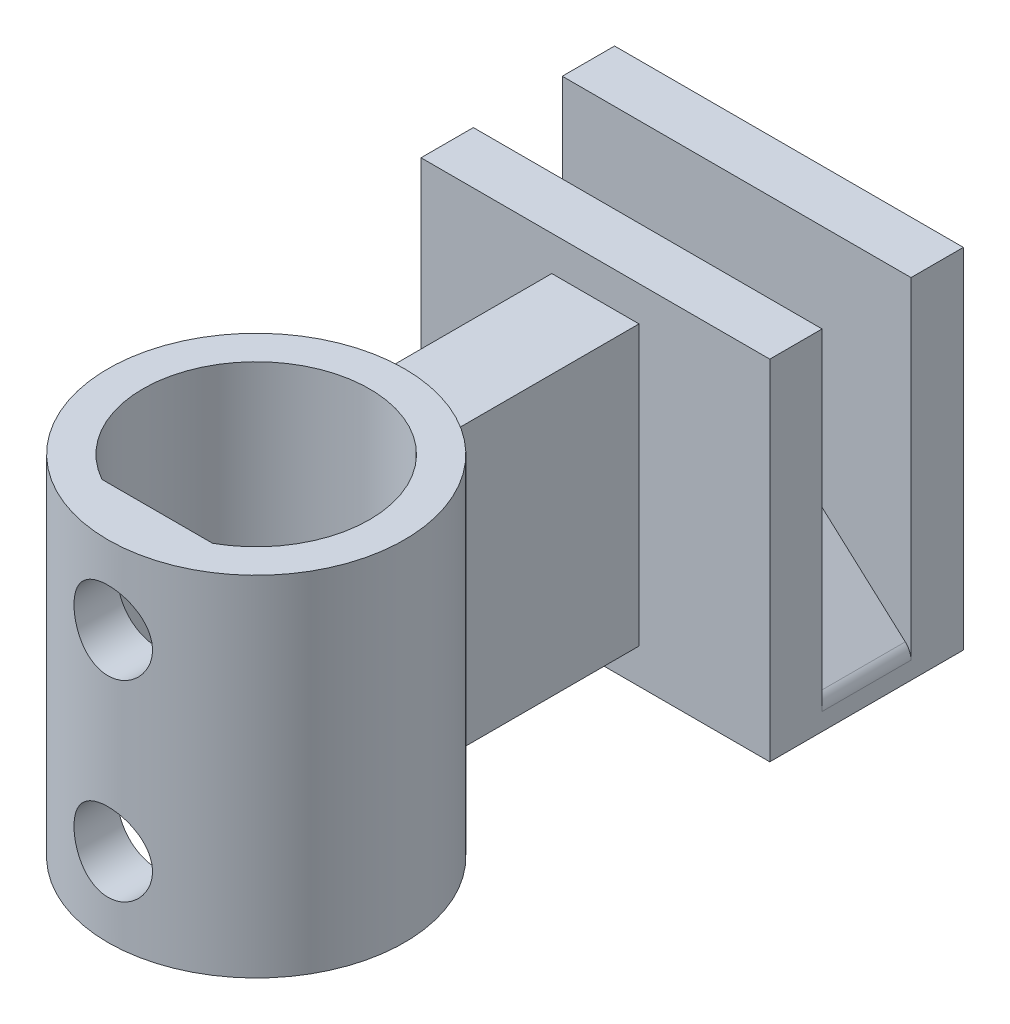
ISO-10303-21;
HEADER;
FILE_DESCRIPTION(('STEP AP214'),'2;1');
FILE_NAME('part.step','',(''),(''),'','','');
FILE_SCHEMA(('AUTOMOTIVE_DESIGN { 1 0 10303 214 1 1 1 1 }'));
ENDSEC;
DATA;
#1=APPLICATION_CONTEXT('core data for automotive mechanical design processes');
#2=APPLICATION_PROTOCOL_DEFINITION('international standard','automotive_design',2000,#1);
#3=PRODUCT_CONTEXT('',#1,'mechanical');
#4=PRODUCT('Part','Part','',(#3));
#5=PRODUCT_RELATED_PRODUCT_CATEGORY('part','',(#4));
#6=PRODUCT_DEFINITION_FORMATION('','',#4);
#7=PRODUCT_DEFINITION_CONTEXT('part definition',#1,'design');
#8=PRODUCT_DEFINITION('design','',#6,#7);
#9=PRODUCT_DEFINITION_SHAPE('','',#8);
#10=(LENGTH_UNIT() NAMED_UNIT(*) SI_UNIT(.MILLI.,.METRE.));
#11=(NAMED_UNIT(*) PLANE_ANGLE_UNIT() SI_UNIT($,.RADIAN.));
#12=(NAMED_UNIT(*) SI_UNIT($,.STERADIAN.) SOLID_ANGLE_UNIT());
#13=UNCERTAINTY_MEASURE_WITH_UNIT(LENGTH_MEASURE(1.E-05),#10,'distance_accuracy_value','');
#14=(GEOMETRIC_REPRESENTATION_CONTEXT(3) GLOBAL_UNCERTAINTY_ASSIGNED_CONTEXT((#13)) GLOBAL_UNIT_ASSIGNED_CONTEXT((#10,
#11,#12)) REPRESENTATION_CONTEXT('',''));
#15=CARTESIAN_POINT('',(0.,0.,0.));
#16=DIRECTION('',(0.,0.,1.));
#17=DIRECTION('',(1.,0.,0.));
#18=AXIS2_PLACEMENT_3D('',#15,#16,#17);
#19=CARTESIAN_POINT('',(0.,39.0416305603426,25.));
#20=DIRECTION('',(0.,-1.,0.));
#21=DIRECTION('',(0.,0.,-1.));
#22=AXIS2_PLACEMENT_3D('',#19,#20,#21);
#23=CYLINDRICAL_SURFACE('',#22,8.5);
#24=CARTESIAN_POINT('',(0.,15.,25.));
#25=DIRECTION('',(0.,-1.,0.));
#26=DIRECTION('',(0.,0.,-1.));
#27=AXIS2_PLACEMENT_3D('',#24,#25,#26);
#28=CIRCLE('',#27,8.5);
#29=CARTESIAN_POINT('',(0.,15.,16.5));
#30=VERTEX_POINT('',#29);
#31=EDGE_CURVE('E186',#30,#30,#28,.T.);
#32=ORIENTED_EDGE('',*,*,#31,.T.);
#33=EDGE_LOOP('',(#32));
#34=FACE_BOUND('',#33,.T.);
#35=CARTESIAN_POINT('',(0.,-5.,25.));
#36=DIRECTION('',(0.,1.,0.));
#37=DIRECTION('',(0.,0.,1.));
#38=AXIS2_PLACEMENT_3D('',#35,#36,#37);
#39=CIRCLE('',#38,8.5);
#40=CARTESIAN_POINT('',(0.,-5.,33.5));
#41=VERTEX_POINT('',#40);
#42=EDGE_CURVE('E192',#41,#41,#39,.F.);
#43=ORIENTED_EDGE('',*,*,#42,.F.);
#44=EDGE_LOOP('',(#43));
#45=FACE_BOUND('',#44,.T.);
#46=CARTESIAN_POINT('',(0.,-3.,25.));
#47=DIRECTION('',(0.,1.,0.));
#48=DIRECTION('',(0.,0.,1.));
#49=AXIS2_PLACEMENT_3D('',#46,#47,#48);
#50=CIRCLE('',#49,8.5);
#51=CARTESIAN_POINT('',(-2.5,-3.,16.875961595364));
#52=VERTEX_POINT('',#51);
#53=CARTESIAN_POINT('',(2.5,-3.,16.875961595364));
#54=VERTEX_POINT('',#53);
#55=EDGE_CURVE('E226',#52,#54,#50,.F.);
#56=ORIENTED_EDGE('',*,*,#55,.T.);
#57=DIRECTION('',(0.,-1.,0.));
#58=VECTOR('',#57,1.);
#59=CARTESIAN_POINT('',(2.5,39.0416305603426,16.875961595364));
#60=LINE('',#59,#58);
#61=CARTESIAN_POINT('',(2.5,13.,16.875961595364));
#62=VERTEX_POINT('',#61);
#63=EDGE_CURVE('E211',#54,#62,#60,.F.);
#64=ORIENTED_EDGE('',*,*,#63,.T.);
#65=CARTESIAN_POINT('',(0.,13.,25.));
#66=DIRECTION('',(0.,-1.,0.));
#67=DIRECTION('',(0.,0.,-1.));
#68=AXIS2_PLACEMENT_3D('',#65,#66,#67);
#69=CIRCLE('',#68,8.5);
#70=CARTESIAN_POINT('',(-2.5,13.,16.875961595364));
#71=VERTEX_POINT('',#70);
#72=EDGE_CURVE('E233',#62,#71,#69,.F.);
#73=ORIENTED_EDGE('',*,*,#72,.T.);
#74=DIRECTION('',(0.,-1.,0.));
#75=VECTOR('',#74,1.);
#76=CARTESIAN_POINT('',(-2.5,39.0416305603426,16.875961595364));
#77=LINE('',#76,#75);
#78=EDGE_CURVE('E230',#71,#52,#77,.T.);
#79=ORIENTED_EDGE('',*,*,#78,.T.);
#80=EDGE_LOOP('',(#56,#64,#73,#79));
#81=FACE_BOUND('',#80,.T.);
#82=CARTESIAN_POINT('',(-2.25,10.5,33.1967981553775));
#83=CARTESIAN_POINT('',(-2.24999694180408,10.6239840002776,33.1968003362435));
#84=CARTESIAN_POINT('',(-2.23971706610501,10.7480005412109,33.1996419584915));
#85=CARTESIAN_POINT('',(-2.198945615888,10.9924544608563,33.2106680196964));
#86=CARTESIAN_POINT('',(-2.16844370713168,11.112889976629,33.2188551904021));
#87=CARTESIAN_POINT('',(-2.0882990785985,11.3466102401079,33.2395815791112));
#88=CARTESIAN_POINT('',(-2.03868300476042,11.459904688051,33.2521147362105));
#89=CARTESIAN_POINT('',(-1.92180166354043,11.6765786826062,33.2801132198881));
#90=CARTESIAN_POINT('',(-1.85453509902009,11.7799574997535,33.2955787619447));
#91=CARTESIAN_POINT('',(-1.70248951742595,11.9764139017784,33.3281265446091));
#92=CARTESIAN_POINT('',(-1.61735395744878,12.0692109081865,33.3452371126252));
#93=CARTESIAN_POINT('',(-1.4327540142738,12.2393902103004,33.3789023677977));
#94=CARTESIAN_POINT('',(-1.33328816547564,12.3167709274061,33.3954569978831));
#95=CARTESIAN_POINT('',(-1.12090838569079,12.4550884366435,33.4264608929721));
#96=CARTESIAN_POINT('',(-1.00780712819347,12.5157466883929,33.4408728427373));
#97=CARTESIAN_POINT('',(-0.772566710508234,12.6170815196129,33.4656427357432));
#98=CARTESIAN_POINT('',(-0.650429055025734,12.6577614172222,33.4760013521304));
#99=CARTESIAN_POINT('',(-0.403511110172187,12.7170778425828,33.4912971460741));
#100=CARTESIAN_POINT('',(-0.278852839843893,12.7361915561904,33.4963515042717));
#101=CARTESIAN_POINT('',(-0.0280034780646866,12.7533339423421,33.5008788349257));
#102=CARTESIAN_POINT('',(0.0981873570184365,12.7513660941808,33.5003527283806));
#103=CARTESIAN_POINT('',(0.34519977639906,12.7267381177659,33.4938644304373));
#104=CARTESIAN_POINT('',(0.466076857336715,12.7045934898765,33.4880376721779));
#105=CARTESIAN_POINT('',(0.702334013138001,12.6410728615727,33.4717623278363));
#106=CARTESIAN_POINT('',(0.817713776487286,12.5996957727456,33.4613134801802));
#107=CARTESIAN_POINT('',(1.04102215095086,12.4984870248307,33.4367663576623));
#108=CARTESIAN_POINT('',(1.14886634833951,12.4384779194592,33.4226332115479));
#109=CARTESIAN_POINT('',(1.3531303740591,12.301844580475,33.3922415251126));
#110=CARTESIAN_POINT('',(1.44954799839656,12.2252171495074,33.375982576028));
#111=CARTESIAN_POINT('',(1.63129857081783,12.0547825542084,33.342521924539));
#112=CARTESIAN_POINT('',(1.71620777876131,11.9605256731685,33.3253065822884));
#113=CARTESIAN_POINT('',(1.86911637013184,11.7589321307718,33.2923181202052));
#114=CARTESIAN_POINT('',(1.93711475347608,11.6515946964081,33.2765450857034));
#115=CARTESIAN_POINT('',(2.05458778503724,11.4259787352489,33.2481731019722));
#116=CARTESIAN_POINT('',(2.10394886477225,11.3076384369629,33.2355937612802));
#117=CARTESIAN_POINT('',(2.18193716023719,11.0639230764637,33.2152779792318));
#118=CARTESIAN_POINT('',(2.21056943128527,10.9385497375025,33.207540357145));
#119=CARTESIAN_POINT('',(2.24556016825425,10.6882860893502,33.1980351929453));
#120=CARTESIAN_POINT('',(2.25255005779307,10.5634903897575,33.1960984643835));
#121=CARTESIAN_POINT('',(2.24579596911986,10.3145136151024,33.1979517680045));
#122=CARTESIAN_POINT('',(2.23205416085442,10.19033247708,33.2017412008412));
#123=CARTESIAN_POINT('',(2.18478304951454,9.94853203437677,33.2144565867633));
#124=CARTESIAN_POINT('',(2.15163187005439,9.83083314067768,33.2232843058655));
#125=CARTESIAN_POINT('',(2.06690749717098,9.60266578735862,33.2449859622244));
#126=CARTESIAN_POINT('',(2.0153319242454,9.49219826384843,33.2578604220901));
#127=CARTESIAN_POINT('',(1.89393612864426,9.27898360406455,33.2865532711528));
#128=CARTESIAN_POINT('',(1.82374430356199,9.17645600255329,33.3024294781708));
#129=CARTESIAN_POINT('',(1.66757023068808,8.98440278488017,33.3352002454647));
#130=CARTESIAN_POINT('',(1.58158505971235,8.89487958119961,33.3520949938724));
#131=CARTESIAN_POINT('',(1.39334723217788,8.72876291555247,33.3855805923336));
#132=CARTESIAN_POINT('',(1.29070161878611,8.65260935870141,33.4021491503459));
#133=CARTESIAN_POINT('',(1.07371678547403,8.51861464758931,33.4326221761272));
#134=CARTESIAN_POINT('',(0.959378187911347,8.46077251937521,33.4465267855714));
#135=CARTESIAN_POINT('',(0.723057226149525,8.36557056201773,33.470015772103));
#136=CARTESIAN_POINT('',(0.60113959611423,8.32805833034544,33.4796321961789));
#137=CARTESIAN_POINT('',(0.352439036803731,8.2741367860407,33.4936022569498));
#138=CARTESIAN_POINT('',(0.225657174963255,8.25772287044393,33.4979570415506));
#139=CARTESIAN_POINT('',(-0.0250604722587875,8.24674873433714,33.5008598374346));
#140=CARTESIAN_POINT('',(-0.148966409472797,8.2515427679478,33.499579436696));
#141=CARTESIAN_POINT('',(-0.394141954180563,8.28135153536109,33.4917428575153));
#142=CARTESIAN_POINT('',(-0.515411657917084,8.30636552970252,33.4851868720061));
#143=CARTESIAN_POINT('',(-0.751107699159933,8.37554121781611,33.4675689262979));
#144=CARTESIAN_POINT('',(-0.865574416324465,8.41957360028427,33.4565374265752));
#145=CARTESIAN_POINT('',(-1.08556048681217,8.5254205314973,33.4311229382255));
#146=CARTESIAN_POINT('',(-1.19107859706731,8.58723754551755,33.4167394850088));
#147=CARTESIAN_POINT('',(-1.39318530515942,8.72879850578497,33.3856885458129));
#148=CARTESIAN_POINT('',(-1.48946543719377,8.80897181418192,33.3689708718519));
#149=CARTESIAN_POINT('',(-1.66742398064291,8.98415288335479,33.3353414220771));
#150=CARTESIAN_POINT('',(-1.74909856114583,9.07916452389294,33.3184295965731));
#151=CARTESIAN_POINT('',(-1.8972708258445,9.2837921479421,33.285906991571));
#152=CARTESIAN_POINT('',(-1.96340296292341,9.39367904330234,33.2703321637851));
#153=CARTESIAN_POINT('',(-2.07615948784757,9.62341015894324,33.2427515934587));
#154=CARTESIAN_POINT('',(-2.12279681152532,9.74324771294936,33.2307434857482));
#155=CARTESIAN_POINT('',(-2.18903256232817,9.96889360228065,33.2133487458215));
#156=CARTESIAN_POINT('',(-2.21184214669942,10.0737109686333,33.2071920574266));
#157=CARTESIAN_POINT('',(-2.24232635318084,10.2856776239988,33.1989160421293));
#158=CARTESIAN_POINT('',(-2.25000264354342,10.3928266546586,33.1967962702092));
#159=CARTESIAN_POINT('',(-2.25,10.5,33.1967981553775));
#160=B_SPLINE_CURVE_WITH_KNOTS('',3,(#82,#83,#84,#85,#86,#87,#88,#89,#90,#91,#92,#93,#94,#95,
#96,#97,#98,#99,#100,#101,#102,#103,#104,#105,#106,#107,#108,#109,#110,#111,#112,#113,#114,#115,
#116,#117,#118,#119,#120,#121,#122,#123,#124,#125,#126,#127,#128,#129,#130,#131,#132,#133,#134,
#135,#136,#137,#138,#139,#140,#141,#142,#143,#144,#145,#146,#147,#148,#149,#150,#151,#152,#153,
#154,#155,#156,#157,#158,#159),.UNSPECIFIED.,.T.,.F.,(4,2,2,2,2,2,2,2,2,2,2,2,2,2,2,2,2,2,2,2,2,
2,2,2,2,2,2,2,2,2,2,2,2,2,2,2,2,2,4),(0.,0.37155797163531,0.743305970231715,1.11453760110695,
1.48579652152091,1.86532086241599,2.24488404596034,2.63043245150024,3.01591680090743,
3.39269333716487,3.76940769129443,4.13675920765004,4.50413151587257,4.87511584526133,
5.24617161521628,5.62845622010334,6.01076342740043,6.3953640456007,6.77987083621654,
7.15304843134813,7.52618696941451,7.89228731518204,8.25843495975225,8.63252754907452,
9.00668944894658,9.39148781847044,9.77626571779774,10.1581177737158,10.539886507824,
10.9101123860205,11.2803247253535,11.6480585642679,12.0158434024024,12.3933170752266,
12.7708896114263,13.156610044578,13.5420741241071,13.8632889681006,14.1844684002793),.UNSPECIFIED.);
#161=CARTESIAN_POINT('',(-2.25,10.5,33.1967981553775));
#162=VERTEX_POINT('',#161);
#163=EDGE_CURVE('E198',#162,#162,#160,.T.);
#164=ORIENTED_EDGE('',*,*,#163,.T.);
#165=EDGE_LOOP('',(#164));
#166=FACE_BOUND('',#165,.T.);
#167=CARTESIAN_POINT('',(-2.25,-0.500000000000002,33.1967981553775));
#168=CARTESIAN_POINT('',(-2.24999694180408,-0.376015999722374,33.1968003362435));
#169=CARTESIAN_POINT('',(-2.23971706610501,-0.251999458789078,33.1996419584915));
#170=CARTESIAN_POINT('',(-2.198945615888,-0.00754553914369019,33.2106680196964));
#171=CARTESIAN_POINT('',(-2.16844370713168,0.112889976628972,33.2188551904021));
#172=CARTESIAN_POINT('',(-2.0882990785985,0.346610240107896,33.2395815791112));
#173=CARTESIAN_POINT('',(-2.03868300476042,0.459904688051024,33.2521147362105));
#174=CARTESIAN_POINT('',(-1.92180166354043,0.676578682606188,33.2801132198881));
#175=CARTESIAN_POINT('',(-1.85453509902009,0.779957499753548,33.2955787619447));
#176=CARTESIAN_POINT('',(-1.70248951742595,0.976413901778359,33.3281265446091));
#177=CARTESIAN_POINT('',(-1.61735395744878,1.06921090818649,33.3452371126252));
#178=CARTESIAN_POINT('',(-1.4327540142738,1.23939021030035,33.3789023677977));
#179=CARTESIAN_POINT('',(-1.33328816547564,1.31677092740614,33.3954569978831));
#180=CARTESIAN_POINT('',(-1.12090838569079,1.45508843664353,33.426460892972));
#181=CARTESIAN_POINT('',(-1.00780712819347,1.51574668839292,33.4408728427372));
#182=CARTESIAN_POINT('',(-0.772566710508234,1.6170815196129,33.4656427357431));
#183=CARTESIAN_POINT('',(-0.650429055025735,1.65776141722221,33.4760013521304));
#184=CARTESIAN_POINT('',(-0.403511110172187,1.71707784258281,33.4912971460741));
#185=CARTESIAN_POINT('',(-0.278852839843893,1.73619155619042,33.4963515042717));
#186=CARTESIAN_POINT('',(-0.0280034780646869,1.75333394234214,33.5008788349257));
#187=CARTESIAN_POINT('',(0.0981873570184361,1.75136609418084,33.5003527283806));
#188=CARTESIAN_POINT('',(0.34519977639906,1.72673811776592,33.4938644304373));
#189=CARTESIAN_POINT('',(0.466076857336715,1.70459348987647,33.4880376721779));
#190=CARTESIAN_POINT('',(0.702334013138001,1.6410728615727,33.4717623278363));
#191=CARTESIAN_POINT('',(0.817713776487285,1.59969577274563,33.4613134801802));
#192=CARTESIAN_POINT('',(1.04102215095086,1.49848702483075,33.4367663576623));
#193=CARTESIAN_POINT('',(1.14886634833951,1.43847791945919,33.4226332115479));
#194=CARTESIAN_POINT('',(1.3531303740591,1.30184458047502,33.3922415251126));
#195=CARTESIAN_POINT('',(1.44954799839656,1.22521714950741,33.375982576028));
#196=CARTESIAN_POINT('',(1.63129857081783,1.05478255420836,33.342521924539));
#197=CARTESIAN_POINT('',(1.71620777876131,0.960525673168511,33.3253065822884));
#198=CARTESIAN_POINT('',(1.86911637013183,0.758932130771777,33.2923181202052));
#199=CARTESIAN_POINT('',(1.93711475347608,0.651594696408099,33.2765450857034));
#200=CARTESIAN_POINT('',(2.05458778503724,0.425978735248875,33.2481731019722));
#201=CARTESIAN_POINT('',(2.10394886477225,0.307638436962872,33.2355937612802));
#202=CARTESIAN_POINT('',(2.18193716023719,0.0639230764637289,33.2152779792318));
#203=CARTESIAN_POINT('',(2.21056943128527,-0.0614502624975041,33.207540357145));
#204=CARTESIAN_POINT('',(2.24556016825425,-0.311713910649751,33.1980351929453));
#205=CARTESIAN_POINT('',(2.25255005779307,-0.436509610242537,33.1960984643835));
#206=CARTESIAN_POINT('',(2.24579596911986,-0.685486384897617,33.1979517680045));
#207=CARTESIAN_POINT('',(2.23205416085442,-0.809667522920008,33.2017412008412));
#208=CARTESIAN_POINT('',(2.18478304951454,-1.05146796562323,33.2144565867633));
#209=CARTESIAN_POINT('',(2.15163187005439,-1.16916685932232,33.2232843058654));
#210=CARTESIAN_POINT('',(2.06690749717098,-1.39733421264138,33.2449859622244));
#211=CARTESIAN_POINT('',(2.0153319242454,-1.50780173615157,33.2578604220901));
#212=CARTESIAN_POINT('',(1.89393612864426,-1.72101639593545,33.2865532711528));
#213=CARTESIAN_POINT('',(1.82374430356199,-1.82354399744671,33.3024294781708));
#214=CARTESIAN_POINT('',(1.66757023068808,-2.01559721511983,33.3352002454647));
#215=CARTESIAN_POINT('',(1.58158505971235,-2.10512041880039,33.3520949938724));
#216=CARTESIAN_POINT('',(1.39334723217788,-2.27123708444753,33.3855805923336));
#217=CARTESIAN_POINT('',(1.29070161878611,-2.34739064129859,33.4021491503459));
#218=CARTESIAN_POINT('',(1.07371678547403,-2.48138535241069,33.4326221761272));
#219=CARTESIAN_POINT('',(0.959378187911347,-2.53922748062479,33.4465267855714));
#220=CARTESIAN_POINT('',(0.723057226149525,-2.63442943798227,33.470015772103));
#221=CARTESIAN_POINT('',(0.60113959611423,-2.67194166965456,33.4796321961789));
#222=CARTESIAN_POINT('',(0.352439036803731,-2.7258632139593,33.4936022569498));
#223=CARTESIAN_POINT('',(0.225657174963256,-2.74227712955607,33.4979570415506));
#224=CARTESIAN_POINT('',(-0.0250604722587871,-2.75325126566286,33.5008598374346));
#225=CARTESIAN_POINT('',(-0.148966409472797,-2.7484572320522,33.499579436696));
#226=CARTESIAN_POINT('',(-0.394141954180563,-2.71864846463891,33.4917428575153));
#227=CARTESIAN_POINT('',(-0.515411657917083,-2.69363447029748,33.4851868720061));
#228=CARTESIAN_POINT('',(-0.751107699159933,-2.62445878218389,33.4675689262979));
#229=CARTESIAN_POINT('',(-0.865574416324465,-2.58042639971573,33.4565374265752));
#230=CARTESIAN_POINT('',(-1.08556048681217,-2.4745794685027,33.4311229382255));
#231=CARTESIAN_POINT('',(-1.19107859706731,-2.41276245448245,33.4167394850088));
#232=CARTESIAN_POINT('',(-1.39318530515942,-2.27120149421503,33.3856885458129));
#233=CARTESIAN_POINT('',(-1.48946543719377,-2.19102818581808,33.3689708718519));
#234=CARTESIAN_POINT('',(-1.66742398064291,-2.01584711664521,33.3353414220771));
#235=CARTESIAN_POINT('',(-1.74909856114582,-1.92083547610706,33.3184295965731));
#236=CARTESIAN_POINT('',(-1.8972708258445,-1.7162078520579,33.285906991571));
#237=CARTESIAN_POINT('',(-1.96340296292341,-1.60632095669767,33.2703321637851));
#238=CARTESIAN_POINT('',(-2.07615948784757,-1.37658984105676,33.2427515934587));
#239=CARTESIAN_POINT('',(-2.12279681152532,-1.25675228705065,33.2307434857482));
#240=CARTESIAN_POINT('',(-2.18903256232817,-1.03110639771935,33.2133487458215));
#241=CARTESIAN_POINT('',(-2.21184214669942,-0.92628903136672,33.2071920574266));
#242=CARTESIAN_POINT('',(-2.24232635318084,-0.714322376001232,33.1989160421293));
#243=CARTESIAN_POINT('',(-2.25000264354342,-0.607173345341352,33.1967962702092));
#244=CARTESIAN_POINT('',(-2.25,-0.500000000000002,33.1967981553775));
#245=B_SPLINE_CURVE_WITH_KNOTS('',3,(#167,#168,#169,#170,#171,#172,#173,#174,#175,#176,#177,
#178,#179,#180,#181,#182,#183,#184,#185,#186,#187,#188,#189,#190,#191,#192,#193,#194,#195,#196,
#197,#198,#199,#200,#201,#202,#203,#204,#205,#206,#207,#208,#209,#210,#211,#212,#213,#214,#215,
#216,#217,#218,#219,#220,#221,#222,#223,#224,#225,#226,#227,#228,#229,#230,#231,#232,#233,#234,
#235,#236,#237,#238,#239,#240,#241,#242,#243,#244),.UNSPECIFIED.,.T.,.F.,(4,2,2,2,2,2,2,2,2,2,2,
2,2,2,2,2,2,2,2,2,2,2,2,2,2,2,2,2,2,2,2,2,2,2,2,2,2,2,4),(0.,0.371557971635309,
0.743305970231715,1.11453760110695,1.48579652152091,1.86532086241599,2.24488404596033,
2.63043245150024,3.01591680090743,3.39269333716487,3.76940769129443,4.13675920765004,
4.50413151587256,4.87511584526133,5.24617161521628,5.62845622010334,6.01076342740043,
6.3953640456007,6.77987083621654,7.15304843134812,7.5261869694145,7.89228731518204,
8.25843495975225,8.63252754907452,9.00668944894658,9.39148781847044,9.77626571779773,
10.1581177737158,10.539886507824,10.9101123860205,11.2803247253535,11.6480585642679,
12.0158434024024,12.3933170752266,12.7708896114263,13.156610044578,13.5420741241071,
13.8632889681006,14.1844684002793),.UNSPECIFIED.);
#246=CARTESIAN_POINT('',(-2.25,-0.500000000000002,33.1967981553775));
#247=VERTEX_POINT('',#246);
#248=EDGE_CURVE('E616',#247,#247,#245,.T.);
#249=ORIENTED_EDGE('',*,*,#248,.T.);
#250=EDGE_LOOP('',(#249));
#251=FACE_BOUND('',#250,.T.);
#252=ADVANCED_FACE('F35',(#34,#45,#81,#166,#251),#23,.T.);
#253=CARTESIAN_POINT('',(0.,0.,5.55));
#254=DIRECTION('',(0.,0.,1.));
#255=DIRECTION('',(1.,0.,0.));
#256=AXIS2_PLACEMENT_3D('',#253,#254,#255);
#257=PLANE('',#256);
#258=DIRECTION('',(0.,1.,0.));
#259=VECTOR('',#258,1.);
#260=CARTESIAN_POINT('',(10.,15.,5.55));
#261=LINE('',#260,#259);
#262=CARTESIAN_POINT('',(10.,-5.,5.55));
#263=VERTEX_POINT('',#262);
#264=CARTESIAN_POINT('',(10.,15.,5.55));
#265=VERTEX_POINT('',#264);
#266=EDGE_CURVE('E263',#263,#265,#261,.T.);
#267=ORIENTED_EDGE('',*,*,#266,.T.);
#268=DIRECTION('',(-1.,0.,0.));
#269=VECTOR('',#268,1.);
#270=CARTESIAN_POINT('',(-10.,15.,5.55));
#271=LINE('',#270,#269);
#272=CARTESIAN_POINT('',(-10.,15.,5.55));
#273=VERTEX_POINT('',#272);
#274=EDGE_CURVE('E266',#265,#273,#271,.T.);
#275=ORIENTED_EDGE('',*,*,#274,.T.);
#276=DIRECTION('',(0.,-1.,0.));
#277=VECTOR('',#276,1.);
#278=CARTESIAN_POINT('',(-10.,15.,5.55));
#279=LINE('',#278,#277);
#280=CARTESIAN_POINT('',(-10.,-5.,5.55));
#281=VERTEX_POINT('',#280);
#282=EDGE_CURVE('E269',#273,#281,#279,.T.);
#283=ORIENTED_EDGE('',*,*,#282,.T.);
#284=DIRECTION('',(1.,0.,0.));
#285=VECTOR('',#284,1.);
#286=CARTESIAN_POINT('',(-10.,-5.,5.55));
#287=LINE('',#286,#285);
#288=EDGE_CURVE('E272',#281,#263,#287,.T.);
#289=ORIENTED_EDGE('',*,*,#288,.T.);
#290=EDGE_LOOP('',(#267,#275,#283,#289));
#291=FACE_BOUND('',#290,.T.);
#292=DIRECTION('',(-1.,0.,0.));
#293=VECTOR('',#292,1.);
#294=CARTESIAN_POINT('',(-2.5,13.,5.55));
#295=LINE('',#294,#293);
#296=CARTESIAN_POINT('',(2.5,13.,5.55));
#297=VERTEX_POINT('',#296);
#298=CARTESIAN_POINT('',(-2.5,13.,5.55));
#299=VERTEX_POINT('',#298);
#300=EDGE_CURVE('E215',#297,#299,#295,.T.);
#301=ORIENTED_EDGE('',*,*,#300,.F.);
#302=DIRECTION('',(0.,1.,0.));
#303=VECTOR('',#302,1.);
#304=CARTESIAN_POINT('',(2.5,13.,5.55));
#305=LINE('',#304,#303);
#306=CARTESIAN_POINT('',(2.5,-3.,5.55));
#307=VERTEX_POINT('',#306);
#308=EDGE_CURVE('E219',#307,#297,#305,.T.);
#309=ORIENTED_EDGE('',*,*,#308,.F.);
#310=DIRECTION('',(1.,0.,0.));
#311=VECTOR('',#310,1.);
#312=CARTESIAN_POINT('',(-2.5,-3.,5.55));
#313=LINE('',#312,#311);
#314=CARTESIAN_POINT('',(-2.5,-3.,5.55));
#315=VERTEX_POINT('',#314);
#316=EDGE_CURVE('E208',#315,#307,#313,.T.);
#317=ORIENTED_EDGE('',*,*,#316,.F.);
#318=DIRECTION('',(0.,-1.,0.));
#319=VECTOR('',#318,1.);
#320=CARTESIAN_POINT('',(-2.5,13.,5.55));
#321=LINE('',#320,#319);
#322=EDGE_CURVE('E52',#299,#315,#321,.T.);
#323=ORIENTED_EDGE('',*,*,#322,.F.);
#324=EDGE_LOOP('',(#301,#309,#317,#323));
#325=FACE_BOUND('',#324,.T.);
#326=ADVANCED_FACE('F396',(#291,#325),#257,.T.);
#327=CARTESIAN_POINT('',(10.,-5.,2.55));
#328=DIRECTION('',(-1.,0.,0.));
#329=DIRECTION('',(0.,0.,1.));
#330=AXIS2_PLACEMENT_3D('',#327,#328,#329);
#331=PLANE('',#330);
#332=DIRECTION('',(0.,0.,-1.));
#333=VECTOR('',#332,1.);
#334=CARTESIAN_POINT('',(10.,-5.,2.55));
#335=LINE('',#334,#333);
#336=CARTESIAN_POINT('',(10.,-5.,-5.55));
#337=VERTEX_POINT('',#336);
#338=EDGE_CURVE('E290',#263,#337,#335,.T.);
#339=ORIENTED_EDGE('',*,*,#338,.T.);
#340=DIRECTION('',(0.,1.,0.));
#341=VECTOR('',#340,1.);
#342=CARTESIAN_POINT('',(10.,15.,-5.55));
#343=LINE('',#342,#341);
#344=CARTESIAN_POINT('',(10.,15.,-5.55));
#345=VERTEX_POINT('',#344);
#346=EDGE_CURVE('E238',#337,#345,#343,.T.);
#347=ORIENTED_EDGE('',*,*,#346,.T.);
#348=DIRECTION('',(0.,0.,1.));
#349=VECTOR('',#348,1.);
#350=CARTESIAN_POINT('',(10.,15.,-5.55));
#351=LINE('',#350,#349);
#352=CARTESIAN_POINT('',(10.,15.,-2.55));
#353=VERTEX_POINT('',#352);
#354=EDGE_CURVE('E251',#345,#353,#351,.T.);
#355=ORIENTED_EDGE('',*,*,#354,.T.);
#356=DIRECTION('',(0.,1.,0.));
#357=VECTOR('',#356,1.);
#358=CARTESIAN_POINT('',(10.,15.,-2.55));
#359=LINE('',#358,#357);
#360=CARTESIAN_POINT('',(10.,-3.99906710613802,-2.55));
#361=VERTEX_POINT('',#360);
#362=EDGE_CURVE('E229',#361,#353,#359,.T.);
#363=ORIENTED_EDGE('',*,*,#362,.F.);
#364=DIRECTION('',(0.,0.,-1.));
#365=VECTOR('',#364,1.);
#366=CARTESIAN_POINT('',(10.,-3.99906710613802,2.55));
#367=LINE('',#366,#365);
#368=CARTESIAN_POINT('',(10.,-3.99906710613802,2.55));
#369=VERTEX_POINT('',#368);
#370=EDGE_CURVE('E336',#361,#369,#367,.F.);
#371=ORIENTED_EDGE('',*,*,#370,.T.);
#372=DIRECTION('',(0.,1.,0.));
#373=VECTOR('',#372,1.);
#374=CARTESIAN_POINT('',(10.,15.,2.55));
#375=LINE('',#374,#373);
#376=CARTESIAN_POINT('',(10.,15.,2.55));
#377=VERTEX_POINT('',#376);
#378=EDGE_CURVE('E262',#369,#377,#375,.T.);
#379=ORIENTED_EDGE('',*,*,#378,.T.);
#380=DIRECTION('',(0.,0.,-1.));
#381=VECTOR('',#380,1.);
#382=CARTESIAN_POINT('',(10.,15.,5.55));
#383=LINE('',#382,#381);
#384=EDGE_CURVE('E283',#265,#377,#383,.T.);
#385=ORIENTED_EDGE('',*,*,#384,.F.);
#386=ORIENTED_EDGE('',*,*,#266,.F.);
#387=EDGE_LOOP('',(#339,#347,#355,#363,#371,#379,#385,#386));
#388=FACE_BOUND('',#387,.T.);
#389=ADVANCED_FACE('F374',(#388),#331,.F.);
#390=CARTESIAN_POINT('',(-10.,5.,2.55));
#391=DIRECTION('',(0.,-1.,0.));
#392=DIRECTION('',(0.,0.,-1.));
#393=AXIS2_PLACEMENT_3D('',#390,#391,#392);
#394=PLANE('',#393);
#395=DIRECTION('',(-1.,0.,0.));
#396=VECTOR('',#395,1.);
#397=CARTESIAN_POINT('',(-10.,5.,2.55));
#398=LINE('',#397,#396);
#399=CARTESIAN_POINT('',(0.116135964964549,5.,2.55));
#400=VERTEX_POINT('',#399);
#401=CARTESIAN_POINT('',(-0.116135964964544,5.,2.55));
#402=VERTEX_POINT('',#401);
#403=EDGE_CURVE('E287',#400,#402,#398,.T.);
#404=ORIENTED_EDGE('',*,*,#403,.F.);
#405=DIRECTION('',(0.,0.,1.));
#406=VECTOR('',#405,1.);
#407=CARTESIAN_POINT('',(0.116135964964549,5.,-2.55));
#408=LINE('',#407,#406);
#409=CARTESIAN_POINT('',(0.116135964964549,5.,-2.55));
#410=VERTEX_POINT('',#409);
#411=EDGE_CURVE('E11',#400,#410,#408,.F.);
#412=ORIENTED_EDGE('',*,*,#411,.T.);
#413=DIRECTION('',(-1.,0.,0.));
#414=VECTOR('',#413,1.);
#415=CARTESIAN_POINT('',(-10.,5.,-2.55));
#416=LINE('',#415,#414);
#417=CARTESIAN_POINT('',(-0.116135964964544,5.,-2.55));
#418=VERTEX_POINT('',#417);
#419=EDGE_CURVE('E286',#410,#418,#416,.T.);
#420=ORIENTED_EDGE('',*,*,#419,.T.);
#421=DIRECTION('',(0.,0.,-1.));
#422=VECTOR('',#421,1.);
#423=CARTESIAN_POINT('',(-0.116135964964544,5.,2.55));
#424=LINE('',#423,#422);
#425=EDGE_CURVE('E44',#418,#402,#424,.F.);
#426=ORIENTED_EDGE('',*,*,#425,.T.);
#427=EDGE_LOOP('',(#404,#412,#420,#426));
#428=FACE_BOUND('',#427,.T.);
#429=ADVANCED_FACE('F344',(#428),#394,.F.);
#430=CARTESIAN_POINT('',(-10.,-5.,2.55));
#431=DIRECTION('',(1.,0.,0.));
#432=DIRECTION('',(0.,0.,-1.));
#433=AXIS2_PLACEMENT_3D('',#430,#431,#432);
#434=PLANE('',#433);
#435=DIRECTION('',(0.,0.,-1.));
#436=VECTOR('',#435,1.);
#437=CARTESIAN_POINT('',(-10.,-5.,2.55));
#438=LINE('',#437,#436);
#439=CARTESIAN_POINT('',(-10.,-5.,-5.55));
#440=VERTEX_POINT('',#439);
#441=EDGE_CURVE('E293',#281,#440,#438,.T.);
#442=ORIENTED_EDGE('',*,*,#441,.F.);
#443=ORIENTED_EDGE('',*,*,#282,.F.);
#444=DIRECTION('',(0.,0.,-1.));
#445=VECTOR('',#444,1.);
#446=CARTESIAN_POINT('',(-10.,15.,5.55));
#447=LINE('',#446,#445);
#448=CARTESIAN_POINT('',(-10.,15.,2.55));
#449=VERTEX_POINT('',#448);
#450=EDGE_CURVE('E275',#273,#449,#447,.T.);
#451=ORIENTED_EDGE('',*,*,#450,.T.);
#452=DIRECTION('',(0.,-1.,0.));
#453=VECTOR('',#452,1.);
#454=CARTESIAN_POINT('',(-10.,15.,2.55));
#455=LINE('',#454,#453);
#456=CARTESIAN_POINT('',(-10.,-3.99906710613802,2.55));
#457=VERTEX_POINT('',#456);
#458=EDGE_CURVE('E267',#449,#457,#455,.T.);
#459=ORIENTED_EDGE('',*,*,#458,.T.);
#460=DIRECTION('',(0.,0.,1.));
#461=VECTOR('',#460,1.);
#462=CARTESIAN_POINT('',(-10.,-3.99906710613802,-2.55));
#463=LINE('',#462,#461);
#464=CARTESIAN_POINT('',(-10.,-3.99906710613802,-2.55));
#465=VERTEX_POINT('',#464);
#466=EDGE_CURVE('E307',#457,#465,#463,.F.);
#467=ORIENTED_EDGE('',*,*,#466,.T.);
#468=DIRECTION('',(0.,-1.,0.));
#469=VECTOR('',#468,1.);
#470=CARTESIAN_POINT('',(-10.,15.,-2.55));
#471=LINE('',#470,#469);
#472=CARTESIAN_POINT('',(-10.,15.,-2.55));
#473=VERTEX_POINT('',#472);
#474=EDGE_CURVE('E253',#473,#465,#471,.T.);
#475=ORIENTED_EDGE('',*,*,#474,.F.);
#476=DIRECTION('',(0.,0.,1.));
#477=VECTOR('',#476,1.);
#478=CARTESIAN_POINT('',(-10.,15.,-5.55));
#479=LINE('',#478,#477);
#480=CARTESIAN_POINT('',(-10.,15.,-5.55));
#481=VERTEX_POINT('',#480);
#482=EDGE_CURVE('E260',#481,#473,#479,.T.);
#483=ORIENTED_EDGE('',*,*,#482,.F.);
#484=DIRECTION('',(0.,-1.,0.));
#485=VECTOR('',#484,1.);
#486=CARTESIAN_POINT('',(-10.,15.,-5.55));
#487=LINE('',#486,#485);
#488=EDGE_CURVE('E245',#481,#440,#487,.T.);
#489=ORIENTED_EDGE('',*,*,#488,.T.);
#490=EDGE_LOOP('',(#442,#443,#451,#459,#467,#475,#483,#489));
#491=FACE_BOUND('',#490,.T.);
#492=ADVANCED_FACE('F365',(#491),#434,.F.);
#493=CARTESIAN_POINT('',(-10.,-5.,2.55));
#494=DIRECTION('',(0.,1.,0.));
#495=DIRECTION('',(0.,0.,1.));
#496=AXIS2_PLACEMENT_3D('',#493,#494,#495);
#497=PLANE('',#496);
#498=ORIENTED_EDGE('',*,*,#441,.T.);
#499=DIRECTION('',(1.,0.,0.));
#500=VECTOR('',#499,1.);
#501=CARTESIAN_POINT('',(-10.,-5.,-5.55));
#502=LINE('',#501,#500);
#503=EDGE_CURVE('E241',#440,#337,#502,.T.);
#504=ORIENTED_EDGE('',*,*,#503,.T.);
#505=ORIENTED_EDGE('',*,*,#338,.F.);
#506=ORIENTED_EDGE('',*,*,#288,.F.);
#507=EDGE_LOOP('',(#498,#504,#505,#506));
#508=FACE_BOUND('',#507,.T.);
#509=ADVANCED_FACE('F384',(#508),#497,.F.);
#510=CARTESIAN_POINT('',(0.499999999999964,5.,2.55));
#511=DIRECTION('',(-0.669130606358857,-0.743144825477396,0.));
#512=DIRECTION('',(0.,0.,-1.));
#513=AXIS2_PLACEMENT_3D('',#510,#511,#512);
#514=PLANE('',#513);
#515=DIRECTION('',(0.743144825477396,-0.669130606358857,0.));
#516=VECTOR('',#515,1.);
#517=CARTESIAN_POINT('',(0.499999999999964,5.,2.55));
#518=LINE('',#517,#516);
#519=CARTESIAN_POINT('',(9.66913060635886,-3.25592228066062,2.55));
#520=VERTEX_POINT('',#519);
#521=CARTESIAN_POINT('',(0.785266571323406,4.7431448254774,2.55));
#522=VERTEX_POINT('',#521);
#523=EDGE_CURVE('E304',#520,#522,#518,.F.);
#524=ORIENTED_EDGE('',*,*,#523,.F.);
#525=DIRECTION('',(0.,0.,1.));
#526=VECTOR('',#525,1.);
#527=CARTESIAN_POINT('',(9.66913060635886,-3.25592228066062,-2.55));
#528=LINE('',#527,#526);
#529=CARTESIAN_POINT('',(9.66913060635886,-3.25592228066062,-2.55));
#530=VERTEX_POINT('',#529);
#531=EDGE_CURVE('E341',#520,#530,#528,.F.);
#532=ORIENTED_EDGE('',*,*,#531,.T.);
#533=DIRECTION('',(-0.743144825477396,0.669130606358857,0.));
#534=VECTOR('',#533,1.);
#535=CARTESIAN_POINT('',(2.71017262260375,3.00995163201119,-2.55));
#536=LINE('',#535,#534);
#537=CARTESIAN_POINT('',(0.785266571323406,4.7431448254774,-2.55));
#538=VERTEX_POINT('',#537);
#539=EDGE_CURVE('E298',#538,#530,#536,.F.);
#540=ORIENTED_EDGE('',*,*,#539,.F.);
#541=DIRECTION('',(0.,0.,-1.));
#542=VECTOR('',#541,1.);
#543=CARTESIAN_POINT('',(0.785266571323406,4.7431448254774,2.55));
#544=LINE('',#543,#542);
#545=EDGE_CURVE('E339',#538,#522,#544,.F.);
#546=ORIENTED_EDGE('',*,*,#545,.T.);
#547=EDGE_LOOP('',(#524,#532,#540,#546));
#548=FACE_BOUND('',#547,.T.);
#549=ADVANCED_FACE('F382',(#548),#514,.F.);
#550=CARTESIAN_POINT('',(-10.,-3.55383842082948,2.55));
#551=DIRECTION('',(0.669130606358857,-0.743144825477396,0.));
#552=DIRECTION('',(0.,0.,-1.));
#553=AXIS2_PLACEMENT_3D('',#550,#551,#552);
#554=PLANE('',#553);
#555=DIRECTION('',(-0.743144825477396,-0.669130606358857,0.));
#556=VECTOR('',#555,1.);
#557=CARTESIAN_POINT('',(-2.71017262260375,3.00995163201119,-2.55));
#558=LINE('',#557,#556);
#559=CARTESIAN_POINT('',(-9.66913060635885,-3.25592228066062,-2.55));
#560=VERTEX_POINT('',#559);
#561=CARTESIAN_POINT('',(-0.7852665713234,4.74314482547739,-2.55));
#562=VERTEX_POINT('',#561);
#563=EDGE_CURVE('E295',#560,#562,#558,.F.);
#564=ORIENTED_EDGE('',*,*,#563,.F.);
#565=DIRECTION('',(0.,0.,-1.));
#566=VECTOR('',#565,1.);
#567=CARTESIAN_POINT('',(-9.66913060635885,-3.25592228066062,2.55));
#568=LINE('',#567,#566);
#569=CARTESIAN_POINT('',(-9.66913060635885,-3.25592228066062,2.55));
#570=VERTEX_POINT('',#569);
#571=EDGE_CURVE('E324',#560,#570,#568,.F.);
#572=ORIENTED_EDGE('',*,*,#571,.T.);
#573=DIRECTION('',(0.743144825477396,0.669130606358857,0.));
#574=VECTOR('',#573,1.);
#575=CARTESIAN_POINT('',(-10.,-3.55383842082948,2.55));
#576=LINE('',#575,#574);
#577=CARTESIAN_POINT('',(-0.7852665713234,4.7431448254774,2.55));
#578=VERTEX_POINT('',#577);
#579=EDGE_CURVE('E301',#578,#570,#576,.F.);
#580=ORIENTED_EDGE('',*,*,#579,.F.);
#581=DIRECTION('',(0.,0.,1.));
#582=VECTOR('',#581,1.);
#583=CARTESIAN_POINT('',(-0.7852665713234,4.7431448254774,-2.55));
#584=LINE('',#583,#582);
#585=EDGE_CURVE('E322',#578,#562,#584,.F.);
#586=ORIENTED_EDGE('',*,*,#585,.T.);
#587=EDGE_LOOP('',(#564,#572,#580,#586));
#588=FACE_BOUND('',#587,.T.);
#589=ADVANCED_FACE('F358',(#588),#554,.F.);
#590=CARTESIAN_POINT('',(-9.,-3.99906710613802,2.55));
#591=DIRECTION('',(0.,0.,-1.));
#592=DIRECTION('',(-1.,0.,0.));
#593=AXIS2_PLACEMENT_3D('',#590,#591,#592);
#594=CYLINDRICAL_SURFACE('',#593,1.);
#595=CARTESIAN_POINT('',(-9.,-3.99906710613802,2.55));
#596=DIRECTION('',(0.,0.,-1.));
#597=DIRECTION('',(-1.,0.,0.));
#598=AXIS2_PLACEMENT_3D('',#595,#596,#597);
#599=CIRCLE('',#598,1.);
#600=EDGE_CURVE('E333',#570,#457,#599,.F.);
#601=ORIENTED_EDGE('',*,*,#600,.F.);
#602=ORIENTED_EDGE('',*,*,#571,.F.);
#603=CARTESIAN_POINT('',(-9.,-3.99906710613802,-2.55));
#604=DIRECTION('',(0.,0.,-1.));
#605=DIRECTION('',(-1.,0.,0.));
#606=AXIS2_PLACEMENT_3D('',#603,#604,#605);
#607=CIRCLE('',#606,1.);
#608=EDGE_CURVE('E319',#465,#560,#607,.T.);
#609=ORIENTED_EDGE('',*,*,#608,.F.);
#610=ORIENTED_EDGE('',*,*,#466,.F.);
#611=EDGE_LOOP('',(#601,#602,#609,#610));
#612=FACE_BOUND('',#611,.T.);
#613=ADVANCED_FACE('F390',(#612),#594,.T.);
#614=CARTESIAN_POINT('',(9.00000000000001,-3.99906710613802,2.55));
#615=DIRECTION('',(0.,0.,1.));
#616=DIRECTION('',(1.,0.,0.));
#617=AXIS2_PLACEMENT_3D('',#614,#615,#616);
#618=CYLINDRICAL_SURFACE('',#617,1.);
#619=CARTESIAN_POINT('',(9.00000000000001,-3.99906710613802,-2.55));
#620=DIRECTION('',(0.,0.,-1.));
#621=DIRECTION('',(-1.,0.,0.));
#622=AXIS2_PLACEMENT_3D('',#619,#620,#621);
#623=CIRCLE('',#622,1.);
#624=EDGE_CURVE('E316',#530,#361,#623,.T.);
#625=ORIENTED_EDGE('',*,*,#624,.F.);
#626=ORIENTED_EDGE('',*,*,#531,.F.);
#627=CARTESIAN_POINT('',(9.00000000000001,-3.99906710613802,2.55));
#628=DIRECTION('',(0.,0.,-1.));
#629=DIRECTION('',(-1.,0.,0.));
#630=AXIS2_PLACEMENT_3D('',#627,#628,#629);
#631=CIRCLE('',#630,1.);
#632=EDGE_CURVE('E330',#369,#520,#631,.F.);
#633=ORIENTED_EDGE('',*,*,#632,.F.);
#634=ORIENTED_EDGE('',*,*,#370,.F.);
#635=EDGE_LOOP('',(#625,#626,#633,#634));
#636=FACE_BOUND('',#635,.T.);
#637=ADVANCED_FACE('F379',(#636),#618,.T.);
#638=CARTESIAN_POINT('',(0.116135964964549,4.,2.55));
#639=DIRECTION('',(0.,0.,-1.));
#640=DIRECTION('',(-1.,0.,0.));
#641=AXIS2_PLACEMENT_3D('',#638,#639,#640);
#642=CYLINDRICAL_SURFACE('',#641,1.);
#643=CARTESIAN_POINT('',(0.116135964964549,4.,2.55));
#644=DIRECTION('',(0.,0.,-1.));
#645=DIRECTION('',(-1.,0.,0.));
#646=AXIS2_PLACEMENT_3D('',#643,#644,#645);
#647=CIRCLE('',#646,1.);
#648=EDGE_CURVE('E327',#522,#400,#647,.F.);
#649=ORIENTED_EDGE('',*,*,#648,.F.);
#650=ORIENTED_EDGE('',*,*,#545,.F.);
#651=CARTESIAN_POINT('',(0.116135964964549,4.,-2.55));
#652=DIRECTION('',(0.,0.,-1.));
#653=DIRECTION('',(-1.,0.,0.));
#654=AXIS2_PLACEMENT_3D('',#651,#652,#653);
#655=CIRCLE('',#654,1.);
#656=EDGE_CURVE('E313',#410,#538,#655,.T.);
#657=ORIENTED_EDGE('',*,*,#656,.F.);
#658=ORIENTED_EDGE('',*,*,#411,.F.);
#659=EDGE_LOOP('',(#649,#650,#657,#658));
#660=FACE_BOUND('',#659,.T.);
#661=ADVANCED_FACE('F353',(#660),#642,.T.);
#662=CARTESIAN_POINT('',(-0.116135964964544,4.,2.55));
#663=DIRECTION('',(0.,0.,1.));
#664=DIRECTION('',(1.,0.,0.));
#665=AXIS2_PLACEMENT_3D('',#662,#663,#664);
#666=CYLINDRICAL_SURFACE('',#665,1.);
#667=CARTESIAN_POINT('',(-0.116135964964544,4.,-2.55));
#668=DIRECTION('',(0.,0.,-1.));
#669=DIRECTION('',(-1.,0.,0.));
#670=AXIS2_PLACEMENT_3D('',#667,#668,#669);
#671=CIRCLE('',#670,1.);
#672=EDGE_CURVE('E310',#562,#418,#671,.T.);
#673=ORIENTED_EDGE('',*,*,#672,.F.);
#674=ORIENTED_EDGE('',*,*,#585,.F.);
#675=CARTESIAN_POINT('',(-0.116135964964544,4.,2.55));
#676=DIRECTION('',(0.,0.,-1.));
#677=DIRECTION('',(-1.,0.,0.));
#678=AXIS2_PLACEMENT_3D('',#675,#676,#677);
#679=CIRCLE('',#678,1.);
#680=EDGE_CURVE('E60',#402,#578,#679,.F.);
#681=ORIENTED_EDGE('',*,*,#680,.F.);
#682=ORIENTED_EDGE('',*,*,#425,.F.);
#683=EDGE_LOOP('',(#673,#674,#681,#682));
#684=FACE_BOUND('',#683,.T.);
#685=ADVANCED_FACE('F37',(#684),#666,.T.);
#686=CARTESIAN_POINT('',(-10.,15.,5.55));
#687=DIRECTION('',(0.,-1.,0.));
#688=DIRECTION('',(0.,0.,-1.));
#689=AXIS2_PLACEMENT_3D('',#686,#687,#688);
#690=PLANE('',#689);
#691=DIRECTION('',(-1.,0.,0.));
#692=VECTOR('',#691,1.);
#693=CARTESIAN_POINT('',(-10.,15.,2.55));
#694=LINE('',#693,#692);
#695=EDGE_CURVE('E277',#377,#449,#694,.T.);
#696=ORIENTED_EDGE('',*,*,#695,.T.);
#697=ORIENTED_EDGE('',*,*,#450,.F.);
#698=ORIENTED_EDGE('',*,*,#274,.F.);
#699=ORIENTED_EDGE('',*,*,#384,.T.);
#700=EDGE_LOOP('',(#696,#697,#698,#699));
#701=FACE_BOUND('',#700,.T.);
#702=ADVANCED_FACE('F370',(#701),#690,.F.);
#703=CARTESIAN_POINT('',(0.,0.,2.55));
#704=DIRECTION('',(0.,0.,1.));
#705=DIRECTION('',(1.,0.,0.));
#706=AXIS2_PLACEMENT_3D('',#703,#704,#705);
#707=PLANE('',#706);
#708=ORIENTED_EDGE('',*,*,#579,.T.);
#709=ORIENTED_EDGE('',*,*,#600,.T.);
#710=ORIENTED_EDGE('',*,*,#458,.F.);
#711=ORIENTED_EDGE('',*,*,#695,.F.);
#712=ORIENTED_EDGE('',*,*,#378,.F.);
#713=ORIENTED_EDGE('',*,*,#632,.T.);
#714=ORIENTED_EDGE('',*,*,#523,.T.);
#715=ORIENTED_EDGE('',*,*,#648,.T.);
#716=ORIENTED_EDGE('',*,*,#403,.T.);
#717=ORIENTED_EDGE('',*,*,#680,.T.);
#718=EDGE_LOOP('',(#708,#709,#710,#711,#712,#713,#714,#715,#716,#717));
#719=FACE_BOUND('',#718,.T.);
#720=ADVANCED_FACE('F349',(#719),#707,.F.);
#721=CARTESIAN_POINT('',(-10.,15.,-5.55));
#722=DIRECTION('',(0.,1.,0.));
#723=DIRECTION('',(0.,0.,1.));
#724=AXIS2_PLACEMENT_3D('',#721,#722,#723);
#725=PLANE('',#724);
#726=DIRECTION('',(-1.,0.,0.));
#727=VECTOR('',#726,1.);
#728=CARTESIAN_POINT('',(-10.,15.,-2.55));
#729=LINE('',#728,#727);
#730=EDGE_CURVE('E242',#353,#473,#729,.T.);
#731=ORIENTED_EDGE('',*,*,#730,.F.);
#732=ORIENTED_EDGE('',*,*,#354,.F.);
#733=DIRECTION('',(-1.,0.,0.));
#734=VECTOR('',#733,1.);
#735=CARTESIAN_POINT('',(-10.,15.,-5.55));
#736=LINE('',#735,#734);
#737=EDGE_CURVE('E248',#345,#481,#736,.T.);
#738=ORIENTED_EDGE('',*,*,#737,.T.);
#739=ORIENTED_EDGE('',*,*,#482,.T.);
#740=EDGE_LOOP('',(#731,#732,#738,#739));
#741=FACE_BOUND('',#740,.T.);
#742=ADVANCED_FACE('F435',(#741),#725,.T.);
#743=CARTESIAN_POINT('',(0.,0.,-5.55));
#744=DIRECTION('',(0.,0.,-1.));
#745=DIRECTION('',(1.,0.,0.));
#746=AXIS2_PLACEMENT_3D('',#743,#744,#745);
#747=PLANE('',#746);
#748=ORIENTED_EDGE('',*,*,#346,.F.);
#749=ORIENTED_EDGE('',*,*,#503,.F.);
#750=ORIENTED_EDGE('',*,*,#488,.F.);
#751=ORIENTED_EDGE('',*,*,#737,.F.);
#752=EDGE_LOOP('',(#748,#749,#750,#751));
#753=FACE_BOUND('',#752,.T.);
#754=ADVANCED_FACE('F432',(#753),#747,.T.);
#755=CARTESIAN_POINT('',(0.,0.,-2.55));
#756=DIRECTION('',(0.,0.,-1.));
#757=DIRECTION('',(1.,0.,0.));
#758=AXIS2_PLACEMENT_3D('',#755,#756,#757);
#759=PLANE('',#758);
#760=ORIENTED_EDGE('',*,*,#474,.T.);
#761=ORIENTED_EDGE('',*,*,#608,.T.);
#762=ORIENTED_EDGE('',*,*,#563,.T.);
#763=ORIENTED_EDGE('',*,*,#672,.T.);
#764=ORIENTED_EDGE('',*,*,#419,.F.);
#765=ORIENTED_EDGE('',*,*,#656,.T.);
#766=ORIENTED_EDGE('',*,*,#539,.T.);
#767=ORIENTED_EDGE('',*,*,#624,.T.);
#768=ORIENTED_EDGE('',*,*,#362,.T.);
#769=ORIENTED_EDGE('',*,*,#730,.T.);
#770=EDGE_LOOP('',(#760,#761,#762,#763,#764,#765,#766,#767,#768,#769));
#771=FACE_BOUND('',#770,.T.);
#772=ADVANCED_FACE('F355',(#771),#759,.F.);
#773=CARTESIAN_POINT('',(2.5,13.,33.501));
#774=DIRECTION('',(-1.,0.,0.));
#775=DIRECTION('',(0.,-1.,0.));
#776=AXIS2_PLACEMENT_3D('',#773,#774,#775);
#777=PLANE('',#776);
#778=ORIENTED_EDGE('',*,*,#63,.F.);
#779=DIRECTION('',(0.,0.,-1.));
#780=VECTOR('',#779,1.);
#781=CARTESIAN_POINT('',(2.5,-3.,33.501));
#782=LINE('',#781,#780);
#783=EDGE_CURVE('E204',#54,#307,#782,.T.);
#784=ORIENTED_EDGE('',*,*,#783,.T.);
#785=ORIENTED_EDGE('',*,*,#308,.T.);
#786=DIRECTION('',(0.,0.,-1.));
#787=VECTOR('',#786,1.);
#788=CARTESIAN_POINT('',(2.5,13.,33.501));
#789=LINE('',#788,#787);
#790=EDGE_CURVE('E218',#62,#297,#789,.T.);
#791=ORIENTED_EDGE('',*,*,#790,.F.);
#792=EDGE_LOOP('',(#778,#784,#785,#791));
#793=FACE_BOUND('',#792,.T.);
#794=ADVANCED_FACE('F418',(#793),#777,.F.);
#795=CARTESIAN_POINT('',(-2.5,13.,33.501));
#796=DIRECTION('',(0.,-1.,0.));
#797=DIRECTION('',(0.,0.,-1.));
#798=AXIS2_PLACEMENT_3D('',#795,#796,#797);
#799=PLANE('',#798);
#800=ORIENTED_EDGE('',*,*,#72,.F.);
#801=ORIENTED_EDGE('',*,*,#790,.T.);
#802=ORIENTED_EDGE('',*,*,#300,.T.);
#803=DIRECTION('',(0.,0.,-1.));
#804=VECTOR('',#803,1.);
#805=CARTESIAN_POINT('',(-2.5,13.,33.501));
#806=LINE('',#805,#804);
#807=EDGE_CURVE('E214',#71,#299,#806,.T.);
#808=ORIENTED_EDGE('',*,*,#807,.F.);
#809=EDGE_LOOP('',(#800,#801,#802,#808));
#810=FACE_BOUND('',#809,.T.);
#811=ADVANCED_FACE('F421',(#810),#799,.F.);
#812=CARTESIAN_POINT('',(-2.5,13.,33.501));
#813=DIRECTION('',(1.,0.,0.));
#814=DIRECTION('',(0.,1.,0.));
#815=AXIS2_PLACEMENT_3D('',#812,#813,#814);
#816=PLANE('',#815);
#817=ORIENTED_EDGE('',*,*,#78,.F.);
#818=ORIENTED_EDGE('',*,*,#807,.T.);
#819=ORIENTED_EDGE('',*,*,#322,.T.);
#820=DIRECTION('',(0.,0.,-1.));
#821=VECTOR('',#820,1.);
#822=CARTESIAN_POINT('',(-2.5,-3.,33.501));
#823=LINE('',#822,#821);
#824=EDGE_CURVE('E212',#52,#315,#823,.T.);
#825=ORIENTED_EDGE('',*,*,#824,.F.);
#826=EDGE_LOOP('',(#817,#818,#819,#825));
#827=FACE_BOUND('',#826,.T.);
#828=ADVANCED_FACE('F425',(#827),#816,.F.);
#829=CARTESIAN_POINT('',(-2.5,-3.,33.501));
#830=DIRECTION('',(0.,1.,0.));
#831=DIRECTION('',(0.,0.,1.));
#832=AXIS2_PLACEMENT_3D('',#829,#830,#831);
#833=PLANE('',#832);
#834=ORIENTED_EDGE('',*,*,#55,.F.);
#835=ORIENTED_EDGE('',*,*,#824,.T.);
#836=ORIENTED_EDGE('',*,*,#316,.T.);
#837=ORIENTED_EDGE('',*,*,#783,.F.);
#838=EDGE_LOOP('',(#834,#835,#836,#837));
#839=FACE_BOUND('',#838,.T.);
#840=ADVANCED_FACE('F414',(#839),#833,.F.);
#841=CARTESIAN_POINT('',(0.,39.0416305603426,25.));
#842=DIRECTION('',(0.,-1.,0.));
#843=DIRECTION('',(0.,0.,-1.));
#844=AXIS2_PLACEMENT_3D('',#841,#842,#843);
#845=CYLINDRICAL_SURFACE('',#844,6.5);
#846=CARTESIAN_POINT('',(0.,15.,25.));
#847=DIRECTION('',(0.,-1.,0.));
#848=DIRECTION('',(0.,0.,-1.));
#849=AXIS2_PLACEMENT_3D('',#846,#847,#848);
#850=CIRCLE('',#849,6.5);
#851=CARTESIAN_POINT('',(-3.175,15.,30.6718052681664));
#852=VERTEX_POINT('',#851);
#853=CARTESIAN_POINT('',(3.175,15.,30.6718052681664));
#854=VERTEX_POINT('',#853);
#855=EDGE_CURVE('E181',#852,#854,#850,.T.);
#856=ORIENTED_EDGE('',*,*,#855,.F.);
#857=DIRECTION('',(0.,-1.,0.));
#858=VECTOR('',#857,1.);
#859=CARTESIAN_POINT('',(-3.175,39.0416305603426,30.6718052681664));
#860=LINE('',#859,#858);
#861=CARTESIAN_POINT('',(-3.175,-5.,30.6718052681664));
#862=VERTEX_POINT('',#861);
#863=EDGE_CURVE('E176',#852,#862,#860,.T.);
#864=ORIENTED_EDGE('',*,*,#863,.T.);
#865=CARTESIAN_POINT('',(0.,-5.,25.));
#866=DIRECTION('',(0.,1.,0.));
#867=DIRECTION('',(0.,0.,1.));
#868=AXIS2_PLACEMENT_3D('',#865,#866,#867);
#869=CIRCLE('',#868,6.5);
#870=CARTESIAN_POINT('',(3.175,-5.,30.6718052681664));
#871=VERTEX_POINT('',#870);
#872=EDGE_CURVE('E180',#862,#871,#869,.F.);
#873=ORIENTED_EDGE('',*,*,#872,.T.);
#874=DIRECTION('',(0.,-1.,0.));
#875=VECTOR('',#874,1.);
#876=CARTESIAN_POINT('',(3.175,39.0416305603426,30.6718052681664));
#877=LINE('',#876,#875);
#878=EDGE_CURVE('E185',#854,#871,#877,.T.);
#879=ORIENTED_EDGE('',*,*,#878,.F.);
#880=EDGE_LOOP('',(#856,#864,#873,#879));
#881=FACE_BOUND('',#880,.T.);
#882=ADVANCED_FACE('F178',(#881),#845,.F.);
#883=CARTESIAN_POINT('',(-3.175,39.0416305603426,30.6718052681664));
#884=DIRECTION('',(0.,0.,-1.));
#885=DIRECTION('',(-1.,0.,0.));
#886=AXIS2_PLACEMENT_3D('',#883,#884,#885);
#887=PLANE('',#886);
#888=CARTESIAN_POINT('',(0.,-0.500000000000002,30.6718052681664));
#889=DIRECTION('',(0.,0.,-1.));
#890=DIRECTION('',(-1.,0.,0.));
#891=AXIS2_PLACEMENT_3D('',#888,#889,#890);
#892=CIRCLE('',#891,2.25);
#893=CARTESIAN_POINT('',(-2.25,-0.500000000000002,30.6718052681664));
#894=VERTEX_POINT('',#893);
#895=EDGE_CURVE('E39',#894,#894,#892,.F.);
#896=ORIENTED_EDGE('',*,*,#895,.T.);
#897=EDGE_LOOP('',(#896));
#898=FACE_BOUND('',#897,.T.);
#899=CARTESIAN_POINT('',(0.,10.5,30.6718052681664));
#900=DIRECTION('',(0.,0.,-1.));
#901=DIRECTION('',(-1.,0.,0.));
#902=AXIS2_PLACEMENT_3D('',#899,#900,#901);
#903=CIRCLE('',#902,2.25);
#904=CARTESIAN_POINT('',(-2.25,10.5,30.6718052681664));
#905=VERTEX_POINT('',#904);
#906=EDGE_CURVE('E195',#905,#905,#903,.F.);
#907=ORIENTED_EDGE('',*,*,#906,.T.);
#908=EDGE_LOOP('',(#907));
#909=FACE_BOUND('',#908,.T.);
#910=DIRECTION('',(-1.,0.,0.));
#911=VECTOR('',#910,1.);
#912=CARTESIAN_POINT('',(-3.175,15.,30.6718052681664));
#913=LINE('',#912,#911);
#914=EDGE_CURVE('E203',#854,#852,#913,.T.);
#915=ORIENTED_EDGE('',*,*,#914,.F.);
#916=ORIENTED_EDGE('',*,*,#878,.T.);
#917=DIRECTION('',(-1.,0.,0.));
#918=VECTOR('',#917,1.);
#919=CARTESIAN_POINT('',(-3.175,-5.,30.6718052681664));
#920=LINE('',#919,#918);
#921=EDGE_CURVE('E191',#871,#862,#920,.T.);
#922=ORIENTED_EDGE('',*,*,#921,.T.);
#923=ORIENTED_EDGE('',*,*,#863,.F.);
#924=EDGE_LOOP('',(#915,#916,#922,#923));
#925=FACE_BOUND('',#924,.T.);
#926=ADVANCED_FACE('F194',(#898,#909,#925),#887,.T.);
#927=CARTESIAN_POINT('',(-10.,15.,5.55));
#928=DIRECTION('',(0.,-1.,0.));
#929=DIRECTION('',(0.,0.,-1.));
#930=AXIS2_PLACEMENT_3D('',#927,#928,#929);
#931=PLANE('',#930);
#932=ORIENTED_EDGE('',*,*,#855,.T.);
#933=ORIENTED_EDGE('',*,*,#914,.T.);
#934=EDGE_LOOP('',(#932,#933));
#935=FACE_BOUND('',#934,.T.);
#936=ORIENTED_EDGE('',*,*,#31,.F.);
#937=EDGE_LOOP('',(#936));
#938=FACE_BOUND('',#937,.T.);
#939=ADVANCED_FACE('F410',(#935,#938),#931,.F.);
#940=CARTESIAN_POINT('',(-10.,-5.,2.55));
#941=DIRECTION('',(0.,1.,0.));
#942=DIRECTION('',(0.,0.,1.));
#943=AXIS2_PLACEMENT_3D('',#940,#941,#942);
#944=PLANE('',#943);
#945=ORIENTED_EDGE('',*,*,#42,.T.);
#946=EDGE_LOOP('',(#945));
#947=FACE_BOUND('',#946,.T.);
#948=ORIENTED_EDGE('',*,*,#921,.F.);
#949=ORIENTED_EDGE('',*,*,#872,.F.);
#950=EDGE_LOOP('',(#948,#949));
#951=FACE_BOUND('',#950,.T.);
#952=ADVANCED_FACE('F190',(#947,#951),#944,.F.);
#953=CARTESIAN_POINT('',(0.,10.5,33.501));
#954=DIRECTION('',(0.,0.,-1.));
#955=DIRECTION('',(-1.,0.,0.));
#956=AXIS2_PLACEMENT_3D('',#953,#954,#955);
#957=CYLINDRICAL_SURFACE('',#956,2.25);
#958=ORIENTED_EDGE('',*,*,#906,.F.);
#959=EDGE_LOOP('',(#958));
#960=FACE_BOUND('',#959,.T.);
#961=ORIENTED_EDGE('',*,*,#163,.F.);
#962=EDGE_LOOP('',(#961));
#963=FACE_BOUND('',#962,.T.);
#964=ADVANCED_FACE('F578',(#960,#963),#957,.F.);
#965=CARTESIAN_POINT('',(0.,-0.500000000000002,33.501));
#966=DIRECTION('',(0.,0.,-1.));
#967=DIRECTION('',(-1.,0.,0.));
#968=AXIS2_PLACEMENT_3D('',#965,#966,#967);
#969=CYLINDRICAL_SURFACE('',#968,2.25);
#970=ORIENTED_EDGE('',*,*,#895,.F.);
#971=EDGE_LOOP('',(#970));
#972=FACE_BOUND('',#971,.T.);
#973=ORIENTED_EDGE('',*,*,#248,.F.);
#974=EDGE_LOOP('',(#973));
#975=FACE_BOUND('',#974,.T.);
#976=ADVANCED_FACE('F596',(#972,#975),#969,.F.);
#977=CLOSED_SHELL('',(#252,#326,#389,#429,#492,#509,#549,#589,#613,#637,#661,#685,#702,#720,
#742,#754,#772,#794,#811,#828,#840,#882,#926,#939,#952,#964,#976));
#978=MANIFOLD_SOLID_BREP('B2',#977);
#979=ADVANCED_BREP_SHAPE_REPRESENTATION('',(#18,#978),#14);
#980=SHAPE_DEFINITION_REPRESENTATION(#9,#979);
ENDSEC;
END-ISO-10303-21;
